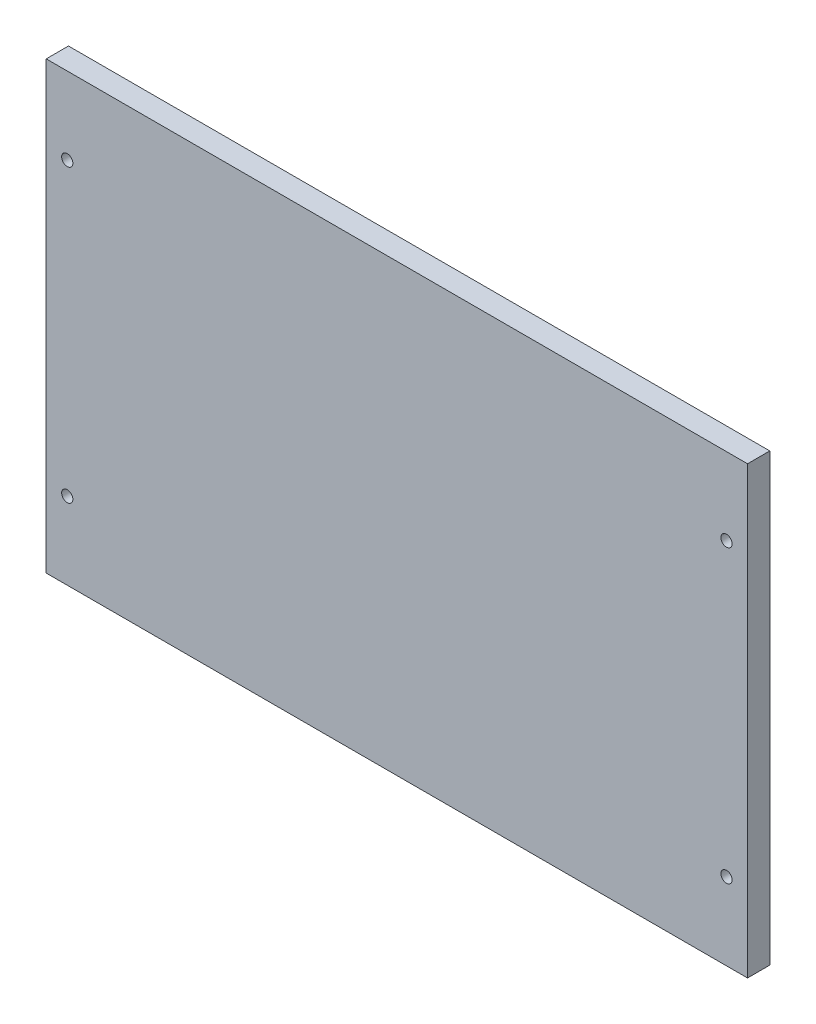
ISO-10303-21;
HEADER;
FILE_DESCRIPTION(('STEP AP214'),'2;1');
FILE_NAME('part.step','',(''),(''),'','','');
FILE_SCHEMA(('AUTOMOTIVE_DESIGN { 1 0 10303 214 1 1 1 1 }'));
ENDSEC;
DATA;
#1=APPLICATION_CONTEXT('core data for automotive mechanical design processes');
#2=APPLICATION_PROTOCOL_DEFINITION('international standard','automotive_design',2000,#1);
#3=PRODUCT_CONTEXT('',#1,'mechanical');
#4=PRODUCT('Part','Part','',(#3));
#5=PRODUCT_RELATED_PRODUCT_CATEGORY('part','',(#4));
#6=PRODUCT_DEFINITION_FORMATION('','',#4);
#7=PRODUCT_DEFINITION_CONTEXT('part definition',#1,'design');
#8=PRODUCT_DEFINITION('design','',#6,#7);
#9=PRODUCT_DEFINITION_SHAPE('','',#8);
#10=(LENGTH_UNIT() NAMED_UNIT(*) SI_UNIT(.MILLI.,.METRE.));
#11=(NAMED_UNIT(*) PLANE_ANGLE_UNIT() SI_UNIT($,.RADIAN.));
#12=(NAMED_UNIT(*) SI_UNIT($,.STERADIAN.) SOLID_ANGLE_UNIT());
#13=UNCERTAINTY_MEASURE_WITH_UNIT(LENGTH_MEASURE(1.E-05),#10,'distance_accuracy_value','');
#14=(GEOMETRIC_REPRESENTATION_CONTEXT(3) GLOBAL_UNCERTAINTY_ASSIGNED_CONTEXT((#13)) GLOBAL_UNIT_ASSIGNED_CONTEXT((#10,
#11,#12)) REPRESENTATION_CONTEXT('',''));
#15=CARTESIAN_POINT('',(0.,0.,0.));
#16=DIRECTION('',(0.,0.,1.));
#17=DIRECTION('',(1.,0.,0.));
#18=AXIS2_PLACEMENT_3D('',#15,#16,#17);
#19=CARTESIAN_POINT('',(0.,0.,6.35));
#20=DIRECTION('',(0.,0.,-1.));
#21=DIRECTION('',(-1.,0.,0.));
#22=AXIS2_PLACEMENT_3D('',#19,#20,#21);
#23=PLANE('',#22);
#24=DIRECTION('',(0.,-1.,0.));
#25=VECTOR('',#24,1.);
#26=CARTESIAN_POINT('',(0.,0.,6.35));
#27=LINE('',#26,#25);
#28=CARTESIAN_POINT('',(0.,127.,6.35));
#29=VERTEX_POINT('',#28);
#30=CARTESIAN_POINT('',(0.,0.,6.35));
#31=VERTEX_POINT('',#30);
#32=EDGE_CURVE('E85',#29,#31,#27,.T.);
#33=ORIENTED_EDGE('',*,*,#32,.T.);
#34=DIRECTION('',(1.,0.,0.));
#35=VECTOR('',#34,1.);
#36=CARTESIAN_POINT('',(0.,0.,6.35));
#37=LINE('',#36,#35);
#38=CARTESIAN_POINT('',(200.,0.,6.35));
#39=VERTEX_POINT('',#38);
#40=EDGE_CURVE('E80',#31,#39,#37,.T.);
#41=ORIENTED_EDGE('',*,*,#40,.T.);
#42=DIRECTION('',(0.,1.,0.));
#43=VECTOR('',#42,1.);
#44=CARTESIAN_POINT('',(200.,0.,6.35));
#45=LINE('',#44,#43);
#46=CARTESIAN_POINT('',(200.,127.,6.35));
#47=VERTEX_POINT('',#46);
#48=EDGE_CURVE('E83',#39,#47,#45,.T.);
#49=ORIENTED_EDGE('',*,*,#48,.T.);
#50=DIRECTION('',(-1.,0.,0.));
#51=VECTOR('',#50,1.);
#52=CARTESIAN_POINT('',(0.,127.,6.35));
#53=LINE('',#52,#51);
#54=EDGE_CURVE('E50',#47,#29,#53,.T.);
#55=ORIENTED_EDGE('',*,*,#54,.T.);
#56=EDGE_LOOP('',(#33,#41,#49,#55));
#57=FACE_BOUND('',#56,.T.);
#58=CARTESIAN_POINT('',(194.,105.,6.35));
#59=DIRECTION('',(0.,0.,1.));
#60=DIRECTION('',(-1.,0.,0.));
#61=AXIS2_PLACEMENT_3D('',#58,#59,#60);
#62=CIRCLE('',#61,1.60000000000002);
#63=CARTESIAN_POINT('',(192.4,105.,6.35));
#64=VERTEX_POINT('',#63);
#65=EDGE_CURVE('E100',#64,#64,#62,.T.);
#66=ORIENTED_EDGE('',*,*,#65,.F.);
#67=EDGE_LOOP('',(#66));
#68=FACE_BOUND('',#67,.T.);
#69=CARTESIAN_POINT('',(194.,22.,6.35));
#70=DIRECTION('',(0.,0.,1.));
#71=DIRECTION('',(1.,0.,0.));
#72=AXIS2_PLACEMENT_3D('',#69,#70,#71);
#73=CIRCLE('',#72,1.60000000000002);
#74=CARTESIAN_POINT('',(195.6,22.,6.35));
#75=VERTEX_POINT('',#74);
#76=EDGE_CURVE('E115',#75,#75,#73,.T.);
#77=ORIENTED_EDGE('',*,*,#76,.F.);
#78=EDGE_LOOP('',(#77));
#79=FACE_BOUND('',#78,.T.);
#80=CARTESIAN_POINT('',(6.,22.,6.35));
#81=DIRECTION('',(0.,0.,1.));
#82=DIRECTION('',(-1.,0.,0.));
#83=AXIS2_PLACEMENT_3D('',#80,#81,#82);
#84=CIRCLE('',#83,1.6);
#85=CARTESIAN_POINT('',(4.4,22.,6.35));
#86=VERTEX_POINT('',#85);
#87=EDGE_CURVE('E121',#86,#86,#84,.T.);
#88=ORIENTED_EDGE('',*,*,#87,.F.);
#89=EDGE_LOOP('',(#88));
#90=FACE_BOUND('',#89,.T.);
#91=CARTESIAN_POINT('',(6.,105.,6.35));
#92=DIRECTION('',(0.,0.,1.));
#93=DIRECTION('',(1.,0.,0.));
#94=AXIS2_PLACEMENT_3D('',#91,#92,#93);
#95=CIRCLE('',#94,1.60000000000001);
#96=CARTESIAN_POINT('',(7.60000000000001,105.,6.35));
#97=VERTEX_POINT('',#96);
#98=EDGE_CURVE('E127',#97,#97,#95,.T.);
#99=ORIENTED_EDGE('',*,*,#98,.F.);
#100=EDGE_LOOP('',(#99));
#101=FACE_BOUND('',#100,.T.);
#102=ADVANCED_FACE('F33',(#57,#68,#79,#90,#101),#23,.F.);
#103=CARTESIAN_POINT('',(0.,0.,0.));
#104=DIRECTION('',(0.,0.,-1.));
#105=DIRECTION('',(-1.,0.,0.));
#106=AXIS2_PLACEMENT_3D('',#103,#104,#105);
#107=PLANE('',#106);
#108=CARTESIAN_POINT('',(6.,22.,0.));
#109=DIRECTION('',(0.,0.,1.));
#110=DIRECTION('',(-1.,0.,0.));
#111=AXIS2_PLACEMENT_3D('',#108,#109,#110);
#112=CIRCLE('',#111,1.6);
#113=CARTESIAN_POINT('',(4.4,22.,0.));
#114=VERTEX_POINT('',#113);
#115=EDGE_CURVE('E124',#114,#114,#112,.T.);
#116=ORIENTED_EDGE('',*,*,#115,.T.);
#117=EDGE_LOOP('',(#116));
#118=FACE_BOUND('',#117,.T.);
#119=CARTESIAN_POINT('',(194.,105.,0.));
#120=DIRECTION('',(0.,0.,1.));
#121=DIRECTION('',(-1.,0.,0.));
#122=AXIS2_PLACEMENT_3D('',#119,#120,#121);
#123=CIRCLE('',#122,1.60000000000002);
#124=CARTESIAN_POINT('',(192.4,105.,0.));
#125=VERTEX_POINT('',#124);
#126=EDGE_CURVE('E112',#125,#125,#123,.T.);
#127=ORIENTED_EDGE('',*,*,#126,.T.);
#128=EDGE_LOOP('',(#127));
#129=FACE_BOUND('',#128,.T.);
#130=DIRECTION('',(0.,-1.,0.));
#131=VECTOR('',#130,1.);
#132=CARTESIAN_POINT('',(0.,0.,0.));
#133=LINE('',#132,#131);
#134=CARTESIAN_POINT('',(0.,127.,0.));
#135=VERTEX_POINT('',#134);
#136=CARTESIAN_POINT('',(0.,0.,0.));
#137=VERTEX_POINT('',#136);
#138=EDGE_CURVE('E97',#135,#137,#133,.T.);
#139=ORIENTED_EDGE('',*,*,#138,.F.);
#140=DIRECTION('',(-1.,0.,0.));
#141=VECTOR('',#140,1.);
#142=CARTESIAN_POINT('',(0.,127.,0.));
#143=LINE('',#142,#141);
#144=CARTESIAN_POINT('',(200.,127.,0.));
#145=VERTEX_POINT('',#144);
#146=EDGE_CURVE('E73',#145,#135,#143,.T.);
#147=ORIENTED_EDGE('',*,*,#146,.F.);
#148=DIRECTION('',(0.,1.,0.));
#149=VECTOR('',#148,1.);
#150=CARTESIAN_POINT('',(200.,0.,0.));
#151=LINE('',#150,#149);
#152=CARTESIAN_POINT('',(200.,0.,0.));
#153=VERTEX_POINT('',#152);
#154=EDGE_CURVE('E67',#153,#145,#151,.T.);
#155=ORIENTED_EDGE('',*,*,#154,.F.);
#156=DIRECTION('',(1.,0.,0.));
#157=VECTOR('',#156,1.);
#158=CARTESIAN_POINT('',(0.,0.,0.));
#159=LINE('',#158,#157);
#160=EDGE_CURVE('E89',#137,#153,#159,.T.);
#161=ORIENTED_EDGE('',*,*,#160,.F.);
#162=EDGE_LOOP('',(#139,#147,#155,#161));
#163=FACE_BOUND('',#162,.T.);
#164=CARTESIAN_POINT('',(194.,22.,0.));
#165=DIRECTION('',(0.,0.,1.));
#166=DIRECTION('',(1.,0.,0.));
#167=AXIS2_PLACEMENT_3D('',#164,#165,#166);
#168=CIRCLE('',#167,1.60000000000002);
#169=CARTESIAN_POINT('',(195.6,22.,0.));
#170=VERTEX_POINT('',#169);
#171=EDGE_CURVE('E118',#170,#170,#168,.T.);
#172=ORIENTED_EDGE('',*,*,#171,.T.);
#173=EDGE_LOOP('',(#172));
#174=FACE_BOUND('',#173,.T.);
#175=CARTESIAN_POINT('',(6.,105.,0.));
#176=DIRECTION('',(0.,0.,1.));
#177=DIRECTION('',(1.,0.,0.));
#178=AXIS2_PLACEMENT_3D('',#175,#176,#177);
#179=CIRCLE('',#178,1.60000000000001);
#180=CARTESIAN_POINT('',(7.60000000000001,105.,0.));
#181=VERTEX_POINT('',#180);
#182=EDGE_CURVE('E130',#181,#181,#179,.T.);
#183=ORIENTED_EDGE('',*,*,#182,.T.);
#184=EDGE_LOOP('',(#183));
#185=FACE_BOUND('',#184,.T.);
#186=ADVANCED_FACE('F108',(#118,#129,#163,#174,#185),#107,.T.);
#187=CARTESIAN_POINT('',(0.,0.,6.35));
#188=DIRECTION('',(1.,0.,0.));
#189=DIRECTION('',(0.,0.,-1.));
#190=AXIS2_PLACEMENT_3D('',#187,#188,#189);
#191=PLANE('',#190);
#192=ORIENTED_EDGE('',*,*,#138,.T.);
#193=DIRECTION('',(0.,0.,-1.));
#194=VECTOR('',#193,1.);
#195=CARTESIAN_POINT('',(0.,0.,6.35));
#196=LINE('',#195,#194);
#197=EDGE_CURVE('E11',#31,#137,#196,.T.);
#198=ORIENTED_EDGE('',*,*,#197,.F.);
#199=ORIENTED_EDGE('',*,*,#32,.F.);
#200=DIRECTION('',(0.,0.,-1.));
#201=VECTOR('',#200,1.);
#202=CARTESIAN_POINT('',(0.,127.,6.35));
#203=LINE('',#202,#201);
#204=EDGE_CURVE('E93',#29,#135,#203,.T.);
#205=ORIENTED_EDGE('',*,*,#204,.T.);
#206=EDGE_LOOP('',(#192,#198,#199,#205));
#207=FACE_BOUND('',#206,.T.);
#208=ADVANCED_FACE('F35',(#207),#191,.F.);
#209=CARTESIAN_POINT('',(0.,0.,6.35));
#210=DIRECTION('',(0.,1.,0.));
#211=DIRECTION('',(0.,0.,1.));
#212=AXIS2_PLACEMENT_3D('',#209,#210,#211);
#213=PLANE('',#212);
#214=ORIENTED_EDGE('',*,*,#160,.T.);
#215=DIRECTION('',(0.,0.,-1.));
#216=VECTOR('',#215,1.);
#217=CARTESIAN_POINT('',(200.,0.,6.35));
#218=LINE('',#217,#216);
#219=EDGE_CURVE('E42',#39,#153,#218,.T.);
#220=ORIENTED_EDGE('',*,*,#219,.F.);
#221=ORIENTED_EDGE('',*,*,#40,.F.);
#222=ORIENTED_EDGE('',*,*,#197,.T.);
#223=EDGE_LOOP('',(#214,#220,#221,#222));
#224=FACE_BOUND('',#223,.T.);
#225=ADVANCED_FACE('F88',(#224),#213,.F.);
#226=CARTESIAN_POINT('',(200.,0.,6.35));
#227=DIRECTION('',(-1.,0.,0.));
#228=DIRECTION('',(0.,0.,1.));
#229=AXIS2_PLACEMENT_3D('',#226,#227,#228);
#230=PLANE('',#229);
#231=ORIENTED_EDGE('',*,*,#154,.T.);
#232=DIRECTION('',(0.,0.,-1.));
#233=VECTOR('',#232,1.);
#234=CARTESIAN_POINT('',(200.,127.,6.35));
#235=LINE('',#234,#233);
#236=EDGE_CURVE('E90',#47,#145,#235,.T.);
#237=ORIENTED_EDGE('',*,*,#236,.F.);
#238=ORIENTED_EDGE('',*,*,#48,.F.);
#239=ORIENTED_EDGE('',*,*,#219,.T.);
#240=EDGE_LOOP('',(#231,#237,#238,#239));
#241=FACE_BOUND('',#240,.T.);
#242=ADVANCED_FACE('F91',(#241),#230,.F.);
#243=CARTESIAN_POINT('',(0.,127.,6.35));
#244=DIRECTION('',(0.,-1.,0.));
#245=DIRECTION('',(0.,0.,-1.));
#246=AXIS2_PLACEMENT_3D('',#243,#244,#245);
#247=PLANE('',#246);
#248=ORIENTED_EDGE('',*,*,#146,.T.);
#249=ORIENTED_EDGE('',*,*,#204,.F.);
#250=ORIENTED_EDGE('',*,*,#54,.F.);
#251=ORIENTED_EDGE('',*,*,#236,.T.);
#252=EDGE_LOOP('',(#248,#249,#250,#251));
#253=FACE_BOUND('',#252,.T.);
#254=ADVANCED_FACE('F105',(#253),#247,.F.);
#255=CARTESIAN_POINT('',(194.,105.,6.35));
#256=DIRECTION('',(0.,0.,-1.));
#257=DIRECTION('',(-1.,0.,0.));
#258=AXIS2_PLACEMENT_3D('',#255,#256,#257);
#259=CYLINDRICAL_SURFACE('',#258,1.60000000000002);
#260=ORIENTED_EDGE('',*,*,#65,.T.);
#261=EDGE_LOOP('',(#260));
#262=FACE_BOUND('',#261,.T.);
#263=ORIENTED_EDGE('',*,*,#126,.F.);
#264=EDGE_LOOP('',(#263));
#265=FACE_BOUND('',#264,.T.);
#266=ADVANCED_FACE('F147',(#262,#265),#259,.F.);
#267=CARTESIAN_POINT('',(194.,22.,6.35));
#268=DIRECTION('',(0.,0.,-1.));
#269=DIRECTION('',(-1.,0.,0.));
#270=AXIS2_PLACEMENT_3D('',#267,#268,#269);
#271=CYLINDRICAL_SURFACE('',#270,1.60000000000002);
#272=ORIENTED_EDGE('',*,*,#76,.T.);
#273=EDGE_LOOP('',(#272));
#274=FACE_BOUND('',#273,.T.);
#275=ORIENTED_EDGE('',*,*,#171,.F.);
#276=EDGE_LOOP('',(#275));
#277=FACE_BOUND('',#276,.T.);
#278=ADVANCED_FACE('F193',(#274,#277),#271,.F.);
#279=CARTESIAN_POINT('',(6.,22.,6.35));
#280=DIRECTION('',(0.,0.,-1.));
#281=DIRECTION('',(-1.,0.,0.));
#282=AXIS2_PLACEMENT_3D('',#279,#280,#281);
#283=CYLINDRICAL_SURFACE('',#282,1.6);
#284=ORIENTED_EDGE('',*,*,#87,.T.);
#285=EDGE_LOOP('',(#284));
#286=FACE_BOUND('',#285,.T.);
#287=ORIENTED_EDGE('',*,*,#115,.F.);
#288=EDGE_LOOP('',(#287));
#289=FACE_BOUND('',#288,.T.);
#290=ADVANCED_FACE('F201',(#286,#289),#283,.F.);
#291=CARTESIAN_POINT('',(6.,105.,6.35));
#292=DIRECTION('',(0.,0.,-1.));
#293=DIRECTION('',(-1.,0.,0.));
#294=AXIS2_PLACEMENT_3D('',#291,#292,#293);
#295=CYLINDRICAL_SURFACE('',#294,1.60000000000001);
#296=ORIENTED_EDGE('',*,*,#98,.T.);
#297=EDGE_LOOP('',(#296));
#298=FACE_BOUND('',#297,.T.);
#299=ORIENTED_EDGE('',*,*,#182,.F.);
#300=EDGE_LOOP('',(#299));
#301=FACE_BOUND('',#300,.T.);
#302=ADVANCED_FACE('F136',(#298,#301),#295,.F.);
#303=CLOSED_SHELL('',(#102,#186,#208,#225,#242,#254,#266,#278,#290,#302));
#304=MANIFOLD_SOLID_BREP('B2',#303);
#305=ADVANCED_BREP_SHAPE_REPRESENTATION('',(#18,#304),#14);
#306=SHAPE_DEFINITION_REPRESENTATION(#9,#305);
ENDSEC;
END-ISO-10303-21;
